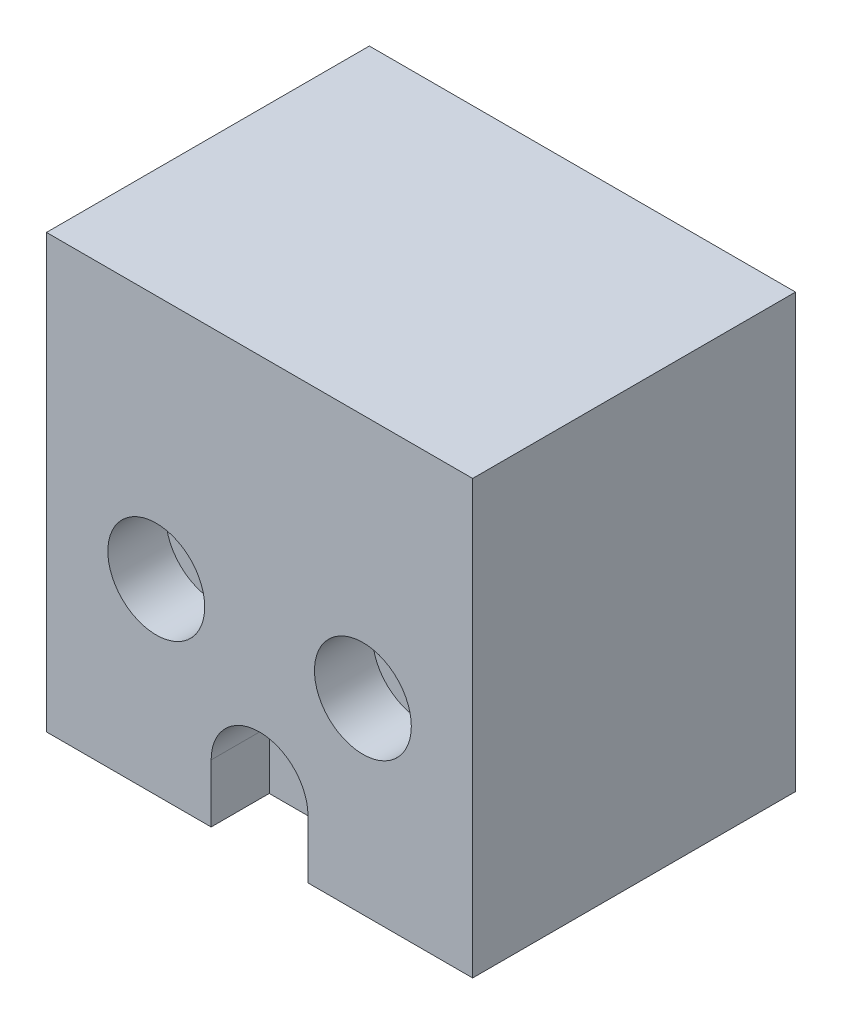
ISO-10303-21;
HEADER;
FILE_DESCRIPTION(('STEP AP214'),'2;1');
FILE_NAME('part.step','',(''),(''),'','','');
FILE_SCHEMA(('AUTOMOTIVE_DESIGN { 1 0 10303 214 1 1 1 1 }'));
ENDSEC;
DATA;
#1=APPLICATION_CONTEXT('core data for automotive mechanical design processes');
#2=APPLICATION_PROTOCOL_DEFINITION('international standard','automotive_design',2000,#1);
#3=PRODUCT_CONTEXT('',#1,'mechanical');
#4=PRODUCT('Part','Part','',(#3));
#5=PRODUCT_RELATED_PRODUCT_CATEGORY('part','',(#4));
#6=PRODUCT_DEFINITION_FORMATION('','',#4);
#7=PRODUCT_DEFINITION_CONTEXT('part definition',#1,'design');
#8=PRODUCT_DEFINITION('design','',#6,#7);
#9=PRODUCT_DEFINITION_SHAPE('','',#8);
#10=(LENGTH_UNIT() NAMED_UNIT(*) SI_UNIT(.MILLI.,.METRE.));
#11=(NAMED_UNIT(*) PLANE_ANGLE_UNIT() SI_UNIT($,.RADIAN.));
#12=(NAMED_UNIT(*) SI_UNIT($,.STERADIAN.) SOLID_ANGLE_UNIT());
#13=UNCERTAINTY_MEASURE_WITH_UNIT(LENGTH_MEASURE(1.E-05),#10,'distance_accuracy_value','');
#14=(GEOMETRIC_REPRESENTATION_CONTEXT(3) GLOBAL_UNCERTAINTY_ASSIGNED_CONTEXT((#13)) GLOBAL_UNIT_ASSIGNED_CONTEXT((#10,
#11,#12)) REPRESENTATION_CONTEXT('',''));
#15=CARTESIAN_POINT('',(0.,0.,0.));
#16=DIRECTION('',(0.,0.,1.));
#17=DIRECTION('',(1.,0.,0.));
#18=AXIS2_PLACEMENT_3D('',#15,#16,#17);
#19=CARTESIAN_POINT('',(0.,4.5,-25.));
#20=DIRECTION('',(0.,0.,1.));
#21=DIRECTION('',(1.,0.,0.));
#22=AXIS2_PLACEMENT_3D('',#19,#20,#21);
#23=CYLINDRICAL_SURFACE('',#22,2.25);
#24=CARTESIAN_POINT('',(0.,4.5,-25.));
#25=DIRECTION('',(0.,0.,1.));
#26=DIRECTION('',(1.,0.,0.));
#27=AXIS2_PLACEMENT_3D('',#24,#25,#26);
#28=CIRCLE('',#27,2.25);
#29=CARTESIAN_POINT('',(2.25,4.5,-25.));
#30=VERTEX_POINT('',#29);
#31=EDGE_CURVE('E156',#30,#30,#28,.T.);
#32=ORIENTED_EDGE('',*,*,#31,.F.);
#33=EDGE_LOOP('',(#32));
#34=FACE_BOUND('',#33,.T.);
#35=CARTESIAN_POINT('',(0.,4.5,-4.5));
#36=DIRECTION('',(0.,0.,1.));
#37=DIRECTION('',(1.,0.,0.));
#38=AXIS2_PLACEMENT_3D('',#35,#36,#37);
#39=CIRCLE('',#38,2.25);
#40=CARTESIAN_POINT('',(2.25,4.5,-4.5));
#41=VERTEX_POINT('',#40);
#42=EDGE_CURVE('E11',#41,#41,#39,.F.);
#43=ORIENTED_EDGE('',*,*,#42,.F.);
#44=EDGE_LOOP('',(#43));
#45=FACE_BOUND('',#44,.T.);
#46=ADVANCED_FACE('F34',(#34,#45),#23,.F.);
#47=CARTESIAN_POINT('',(8.,14.5,-25.));
#48=DIRECTION('',(0.,0.,1.));
#49=DIRECTION('',(1.,0.,0.));
#50=AXIS2_PLACEMENT_3D('',#47,#48,#49);
#51=CYLINDRICAL_SURFACE('',#50,2.25);
#52=CARTESIAN_POINT('',(8.,14.5,-25.));
#53=DIRECTION('',(0.,0.,1.));
#54=DIRECTION('',(1.,0.,0.));
#55=AXIS2_PLACEMENT_3D('',#52,#53,#54);
#56=CIRCLE('',#55,2.25);
#57=CARTESIAN_POINT('',(10.25,14.5,-25.));
#58=VERTEX_POINT('',#57);
#59=EDGE_CURVE('E152',#58,#58,#56,.T.);
#60=ORIENTED_EDGE('',*,*,#59,.F.);
#61=EDGE_LOOP('',(#60));
#62=FACE_BOUND('',#61,.T.);
#63=CARTESIAN_POINT('',(8.,14.5,-4.5));
#64=DIRECTION('',(0.,0.,1.));
#65=DIRECTION('',(1.,0.,0.));
#66=AXIS2_PLACEMENT_3D('',#63,#64,#65);
#67=CIRCLE('',#66,2.25);
#68=CARTESIAN_POINT('',(10.25,14.5,-4.5));
#69=VERTEX_POINT('',#68);
#70=EDGE_CURVE('E38',#69,#69,#67,.F.);
#71=ORIENTED_EDGE('',*,*,#70,.F.);
#72=EDGE_LOOP('',(#71));
#73=FACE_BOUND('',#72,.T.);
#74=ADVANCED_FACE('F231',(#62,#73),#51,.F.);
#75=CARTESIAN_POINT('',(-8.,14.5,-25.));
#76=DIRECTION('',(0.,0.,1.));
#77=DIRECTION('',(1.,0.,0.));
#78=AXIS2_PLACEMENT_3D('',#75,#76,#77);
#79=CYLINDRICAL_SURFACE('',#78,2.25);
#80=CARTESIAN_POINT('',(-8.,14.5,-25.));
#81=DIRECTION('',(0.,0.,1.));
#82=DIRECTION('',(1.,0.,0.));
#83=AXIS2_PLACEMENT_3D('',#80,#81,#82);
#84=CIRCLE('',#83,2.25);
#85=CARTESIAN_POINT('',(-5.75,14.5,-25.));
#86=VERTEX_POINT('',#85);
#87=EDGE_CURVE('E153',#86,#86,#84,.T.);
#88=ORIENTED_EDGE('',*,*,#87,.F.);
#89=EDGE_LOOP('',(#88));
#90=FACE_BOUND('',#89,.T.);
#91=CARTESIAN_POINT('',(-8.,14.5,-4.5));
#92=DIRECTION('',(0.,0.,1.));
#93=DIRECTION('',(1.,0.,0.));
#94=AXIS2_PLACEMENT_3D('',#91,#92,#93);
#95=CIRCLE('',#94,2.25);
#96=CARTESIAN_POINT('',(-5.75,14.5,-4.5));
#97=VERTEX_POINT('',#96);
#98=EDGE_CURVE('E146',#97,#97,#95,.F.);
#99=ORIENTED_EDGE('',*,*,#98,.F.);
#100=EDGE_LOOP('',(#99));
#101=FACE_BOUND('',#100,.T.);
#102=ADVANCED_FACE('F225',(#90,#101),#79,.F.);
#103=CARTESIAN_POINT('',(-16.5,33.5,-25.));
#104=DIRECTION('',(-1.,0.,0.));
#105=DIRECTION('',(0.,-1.,0.));
#106=AXIS2_PLACEMENT_3D('',#103,#104,#105);
#107=PLANE('',#106);
#108=DIRECTION('',(0.,-1.,0.));
#109=VECTOR('',#108,1.);
#110=CARTESIAN_POINT('',(-16.5,33.5,0.));
#111=LINE('',#110,#109);
#112=CARTESIAN_POINT('',(-16.5,33.5,0.));
#113=VERTEX_POINT('',#112);
#114=CARTESIAN_POINT('',(-16.5,0.,0.));
#115=VERTEX_POINT('',#114);
#116=EDGE_CURVE('E161',#113,#115,#111,.T.);
#117=ORIENTED_EDGE('',*,*,#116,.F.);
#118=DIRECTION('',(0.,0.,1.));
#119=VECTOR('',#118,1.);
#120=CARTESIAN_POINT('',(-16.5,33.5,-25.));
#121=LINE('',#120,#119);
#122=CARTESIAN_POINT('',(-16.5,33.5,-25.));
#123=VERTEX_POINT('',#122);
#124=EDGE_CURVE('E44',#123,#113,#121,.T.);
#125=ORIENTED_EDGE('',*,*,#124,.F.);
#126=DIRECTION('',(0.,-1.,0.));
#127=VECTOR('',#126,1.);
#128=CARTESIAN_POINT('',(-16.5,33.5,-25.));
#129=LINE('',#128,#127);
#130=CARTESIAN_POINT('',(-16.5,0.,-25.));
#131=VERTEX_POINT('',#130);
#132=EDGE_CURVE('E162',#123,#131,#129,.T.);
#133=ORIENTED_EDGE('',*,*,#132,.T.);
#134=DIRECTION('',(0.,0.,1.));
#135=VECTOR('',#134,1.);
#136=CARTESIAN_POINT('',(-16.5,0.,-25.));
#137=LINE('',#136,#135);
#138=EDGE_CURVE('E81',#131,#115,#137,.T.);
#139=ORIENTED_EDGE('',*,*,#138,.T.);
#140=EDGE_LOOP('',(#117,#125,#133,#139));
#141=FACE_BOUND('',#140,.T.);
#142=ADVANCED_FACE('F36',(#141),#107,.T.);
#143=CARTESIAN_POINT('',(-16.5,33.5,-25.));
#144=DIRECTION('',(0.,1.,0.));
#145=DIRECTION('',(0.,0.,1.));
#146=AXIS2_PLACEMENT_3D('',#143,#144,#145);
#147=PLANE('',#146);
#148=DIRECTION('',(-1.,0.,0.));
#149=VECTOR('',#148,1.);
#150=CARTESIAN_POINT('',(-16.5,33.5,0.));
#151=LINE('',#150,#149);
#152=CARTESIAN_POINT('',(16.5,33.5,0.));
#153=VERTEX_POINT('',#152);
#154=EDGE_CURVE('E165',#153,#113,#151,.T.);
#155=ORIENTED_EDGE('',*,*,#154,.F.);
#156=DIRECTION('',(0.,0.,1.));
#157=VECTOR('',#156,1.);
#158=CARTESIAN_POINT('',(16.5,33.5,-25.));
#159=LINE('',#158,#157);
#160=CARTESIAN_POINT('',(16.5,33.5,-25.));
#161=VERTEX_POINT('',#160);
#162=EDGE_CURVE('E70',#161,#153,#159,.T.);
#163=ORIENTED_EDGE('',*,*,#162,.F.);
#164=DIRECTION('',(-1.,0.,0.));
#165=VECTOR('',#164,1.);
#166=CARTESIAN_POINT('',(-16.5,33.5,-25.));
#167=LINE('',#166,#165);
#168=EDGE_CURVE('E169',#161,#123,#167,.T.);
#169=ORIENTED_EDGE('',*,*,#168,.T.);
#170=ORIENTED_EDGE('',*,*,#124,.T.);
#171=EDGE_LOOP('',(#155,#163,#169,#170));
#172=FACE_BOUND('',#171,.T.);
#173=ADVANCED_FACE('F219',(#172),#147,.T.);
#174=CARTESIAN_POINT('',(16.5,33.5,-25.));
#175=DIRECTION('',(1.,0.,0.));
#176=DIRECTION('',(0.,1.,0.));
#177=AXIS2_PLACEMENT_3D('',#174,#175,#176);
#178=PLANE('',#177);
#179=DIRECTION('',(0.,1.,0.));
#180=VECTOR('',#179,1.);
#181=CARTESIAN_POINT('',(16.5,33.5,0.));
#182=LINE('',#181,#180);
#183=CARTESIAN_POINT('',(16.5,0.,0.));
#184=VERTEX_POINT('',#183);
#185=EDGE_CURVE('E177',#184,#153,#182,.T.);
#186=ORIENTED_EDGE('',*,*,#185,.F.);
#187=DIRECTION('',(0.,0.,1.));
#188=VECTOR('',#187,1.);
#189=CARTESIAN_POINT('',(16.5,0.,-25.));
#190=LINE('',#189,#188);
#191=CARTESIAN_POINT('',(16.5,0.,-25.));
#192=VERTEX_POINT('',#191);
#193=EDGE_CURVE('E183',#192,#184,#190,.T.);
#194=ORIENTED_EDGE('',*,*,#193,.F.);
#195=DIRECTION('',(0.,1.,0.));
#196=VECTOR('',#195,1.);
#197=CARTESIAN_POINT('',(16.5,33.5,-25.));
#198=LINE('',#197,#196);
#199=EDGE_CURVE('E167',#192,#161,#198,.T.);
#200=ORIENTED_EDGE('',*,*,#199,.T.);
#201=ORIENTED_EDGE('',*,*,#162,.T.);
#202=EDGE_LOOP('',(#186,#194,#200,#201));
#203=FACE_BOUND('',#202,.T.);
#204=ADVANCED_FACE('F222',(#203),#178,.T.);
#205=CARTESIAN_POINT('',(-16.5,0.,-25.));
#206=DIRECTION('',(0.,-1.,0.));
#207=DIRECTION('',(0.,0.,-1.));
#208=AXIS2_PLACEMENT_3D('',#205,#206,#207);
#209=PLANE('',#208);
#210=DIRECTION('',(0.,0.,1.));
#211=VECTOR('',#210,1.);
#212=CARTESIAN_POINT('',(-3.75,0.,-13.246427842268));
#213=LINE('',#212,#211);
#214=CARTESIAN_POINT('',(-3.75,0.,-4.5));
#215=VERTEX_POINT('',#214);
#216=CARTESIAN_POINT('',(-3.75,0.,0.));
#217=VERTEX_POINT('',#216);
#218=EDGE_CURVE('E119',#215,#217,#213,.T.);
#219=ORIENTED_EDGE('',*,*,#218,.T.);
#220=DIRECTION('',(1.,0.,0.));
#221=VECTOR('',#220,1.);
#222=CARTESIAN_POINT('',(-16.5,0.,0.));
#223=LINE('',#222,#221);
#224=EDGE_CURVE('E174',#115,#217,#223,.T.);
#225=ORIENTED_EDGE('',*,*,#224,.F.);
#226=ORIENTED_EDGE('',*,*,#138,.F.);
#227=DIRECTION('',(1.,0.,0.));
#228=VECTOR('',#227,1.);
#229=CARTESIAN_POINT('',(-16.5,0.,-25.));
#230=LINE('',#229,#228);
#231=EDGE_CURVE('E164',#131,#192,#230,.T.);
#232=ORIENTED_EDGE('',*,*,#231,.T.);
#233=ORIENTED_EDGE('',*,*,#193,.T.);
#234=CARTESIAN_POINT('',(3.75,0.,0.));
#235=VERTEX_POINT('',#234);
#236=EDGE_CURVE('E173',#235,#184,#223,.T.);
#237=ORIENTED_EDGE('',*,*,#236,.F.);
#238=DIRECTION('',(0.,0.,1.));
#239=VECTOR('',#238,1.);
#240=CARTESIAN_POINT('',(3.75,0.,-13.246427842268));
#241=LINE('',#240,#239);
#242=CARTESIAN_POINT('',(3.75,0.,-4.5));
#243=VERTEX_POINT('',#242);
#244=EDGE_CURVE('E147',#243,#235,#241,.T.);
#245=ORIENTED_EDGE('',*,*,#244,.F.);
#246=DIRECTION('',(-1.,0.,0.));
#247=VECTOR('',#246,1.);
#248=CARTESIAN_POINT('',(3.75,0.,-4.5));
#249=LINE('',#248,#247);
#250=EDGE_CURVE('E134',#243,#215,#249,.T.);
#251=ORIENTED_EDGE('',*,*,#250,.T.);
#252=EDGE_LOOP('',(#219,#225,#226,#232,#233,#237,#245,#251));
#253=FACE_BOUND('',#252,.T.);
#254=ADVANCED_FACE('F218',(#253),#209,.T.);
#255=CARTESIAN_POINT('',(-16.5,0.,-25.));
#256=DIRECTION('',(0.,0.,1.));
#257=DIRECTION('',(1.,0.,0.));
#258=AXIS2_PLACEMENT_3D('',#255,#256,#257);
#259=PLANE('',#258);
#260=ORIENTED_EDGE('',*,*,#87,.T.);
#261=EDGE_LOOP('',(#260));
#262=FACE_BOUND('',#261,.T.);
#263=ORIENTED_EDGE('',*,*,#59,.T.);
#264=EDGE_LOOP('',(#263));
#265=FACE_BOUND('',#264,.T.);
#266=ORIENTED_EDGE('',*,*,#31,.T.);
#267=EDGE_LOOP('',(#266));
#268=FACE_BOUND('',#267,.T.);
#269=ORIENTED_EDGE('',*,*,#132,.F.);
#270=ORIENTED_EDGE('',*,*,#168,.F.);
#271=ORIENTED_EDGE('',*,*,#199,.F.);
#272=ORIENTED_EDGE('',*,*,#231,.F.);
#273=EDGE_LOOP('',(#269,#270,#271,#272));
#274=FACE_BOUND('',#273,.T.);
#275=ADVANCED_FACE('F210',(#262,#265,#268,#274),#259,.F.);
#276=CARTESIAN_POINT('',(-16.5,0.,0.));
#277=DIRECTION('',(0.,0.,1.));
#278=DIRECTION('',(1.,0.,0.));
#279=AXIS2_PLACEMENT_3D('',#276,#277,#278);
#280=PLANE('',#279);
#281=CARTESIAN_POINT('',(8.,14.5,0.));
#282=DIRECTION('',(0.,0.,1.));
#283=DIRECTION('',(1.,0.,0.));
#284=AXIS2_PLACEMENT_3D('',#281,#282,#283);
#285=CIRCLE('',#284,3.75);
#286=CARTESIAN_POINT('',(11.75,14.5,0.));
#287=VERTEX_POINT('',#286);
#288=EDGE_CURVE('E129',#287,#287,#285,.T.);
#289=ORIENTED_EDGE('',*,*,#288,.F.);
#290=EDGE_LOOP('',(#289));
#291=FACE_BOUND('',#290,.T.);
#292=CARTESIAN_POINT('',(0.,4.5,0.));
#293=DIRECTION('',(0.,0.,1.));
#294=DIRECTION('',(1.,0.,0.));
#295=AXIS2_PLACEMENT_3D('',#292,#293,#294);
#296=CIRCLE('',#295,3.75);
#297=CARTESIAN_POINT('',(3.75,4.5,0.));
#298=VERTEX_POINT('',#297);
#299=CARTESIAN_POINT('',(-3.75,4.5,0.));
#300=VERTEX_POINT('',#299);
#301=EDGE_CURVE('E115',#298,#300,#296,.T.);
#302=ORIENTED_EDGE('',*,*,#301,.F.);
#303=DIRECTION('',(0.,1.,0.));
#304=VECTOR('',#303,1.);
#305=CARTESIAN_POINT('',(3.75,4.5,0.));
#306=LINE('',#305,#304);
#307=EDGE_CURVE('E142',#235,#298,#306,.T.);
#308=ORIENTED_EDGE('',*,*,#307,.F.);
#309=ORIENTED_EDGE('',*,*,#236,.T.);
#310=ORIENTED_EDGE('',*,*,#185,.T.);
#311=ORIENTED_EDGE('',*,*,#154,.T.);
#312=ORIENTED_EDGE('',*,*,#116,.T.);
#313=ORIENTED_EDGE('',*,*,#224,.T.);
#314=DIRECTION('',(0.,-1.,0.));
#315=VECTOR('',#314,1.);
#316=CARTESIAN_POINT('',(-3.75,0.,0.));
#317=LINE('',#316,#315);
#318=EDGE_CURVE('E145',#300,#217,#317,.T.);
#319=ORIENTED_EDGE('',*,*,#318,.F.);
#320=EDGE_LOOP('',(#302,#308,#309,#310,#311,#312,#313,#319));
#321=FACE_BOUND('',#320,.T.);
#322=CARTESIAN_POINT('',(-8.,14.5,0.));
#323=DIRECTION('',(0.,0.,1.));
#324=DIRECTION('',(1.,0.,0.));
#325=AXIS2_PLACEMENT_3D('',#322,#323,#324);
#326=CIRCLE('',#325,3.75);
#327=CARTESIAN_POINT('',(-4.25,14.5,0.));
#328=VERTEX_POINT('',#327);
#329=EDGE_CURVE('E190',#328,#328,#326,.T.);
#330=ORIENTED_EDGE('',*,*,#329,.F.);
#331=EDGE_LOOP('',(#330));
#332=FACE_BOUND('',#331,.T.);
#333=ADVANCED_FACE('F207',(#291,#321,#332),#280,.T.);
#334=CARTESIAN_POINT('',(0.,0.,-4.5));
#335=DIRECTION('',(0.,0.,1.));
#336=DIRECTION('',(1.,0.,0.));
#337=AXIS2_PLACEMENT_3D('',#334,#335,#336);
#338=PLANE('',#337);
#339=ORIENTED_EDGE('',*,*,#42,.T.);
#340=EDGE_LOOP('',(#339));
#341=FACE_BOUND('',#340,.T.);
#342=DIRECTION('',(0.,-1.,0.));
#343=VECTOR('',#342,1.);
#344=CARTESIAN_POINT('',(3.75,4.5,-4.5));
#345=LINE('',#344,#343);
#346=CARTESIAN_POINT('',(3.75,4.5,-4.5));
#347=VERTEX_POINT('',#346);
#348=EDGE_CURVE('E128',#347,#243,#345,.T.);
#349=ORIENTED_EDGE('',*,*,#348,.F.);
#350=CARTESIAN_POINT('',(0.,4.5,-4.5));
#351=DIRECTION('',(0.,0.,1.));
#352=DIRECTION('',(1.,0.,0.));
#353=AXIS2_PLACEMENT_3D('',#350,#351,#352);
#354=CIRCLE('',#353,3.75);
#355=CARTESIAN_POINT('',(-3.75,4.5,-4.5));
#356=VERTEX_POINT('',#355);
#357=EDGE_CURVE('E112',#356,#347,#354,.F.);
#358=ORIENTED_EDGE('',*,*,#357,.F.);
#359=DIRECTION('',(0.,1.,0.));
#360=VECTOR('',#359,1.);
#361=CARTESIAN_POINT('',(-3.75,0.,-4.5));
#362=LINE('',#361,#360);
#363=EDGE_CURVE('E126',#215,#356,#362,.T.);
#364=ORIENTED_EDGE('',*,*,#363,.F.);
#365=ORIENTED_EDGE('',*,*,#250,.F.);
#366=EDGE_LOOP('',(#349,#358,#364,#365));
#367=FACE_BOUND('',#366,.T.);
#368=ADVANCED_FACE('F124',(#341,#367),#338,.T.);
#369=CARTESIAN_POINT('',(-3.75,0.,-13.246427842268));
#370=DIRECTION('',(-1.,0.,0.));
#371=DIRECTION('',(0.,0.,1.));
#372=AXIS2_PLACEMENT_3D('',#369,#370,#371);
#373=PLANE('',#372);
#374=ORIENTED_EDGE('',*,*,#363,.T.);
#375=DIRECTION('',(0.,0.,1.));
#376=VECTOR('',#375,1.);
#377=CARTESIAN_POINT('',(-3.75,4.5,-13.246427842268));
#378=LINE('',#377,#376);
#379=EDGE_CURVE('E109',#356,#300,#378,.T.);
#380=ORIENTED_EDGE('',*,*,#379,.T.);
#381=ORIENTED_EDGE('',*,*,#318,.T.);
#382=ORIENTED_EDGE('',*,*,#218,.F.);
#383=EDGE_LOOP('',(#374,#380,#381,#382));
#384=FACE_BOUND('',#383,.T.);
#385=ADVANCED_FACE('F131',(#384),#373,.F.);
#386=CARTESIAN_POINT('',(3.75,4.5,-13.246427842268));
#387=DIRECTION('',(1.,0.,0.));
#388=DIRECTION('',(0.,0.,-1.));
#389=AXIS2_PLACEMENT_3D('',#386,#387,#388);
#390=PLANE('',#389);
#391=ORIENTED_EDGE('',*,*,#348,.T.);
#392=ORIENTED_EDGE('',*,*,#244,.T.);
#393=ORIENTED_EDGE('',*,*,#307,.T.);
#394=DIRECTION('',(0.,0.,1.));
#395=VECTOR('',#394,1.);
#396=CARTESIAN_POINT('',(3.75,4.5,-13.246427842268));
#397=LINE('',#396,#395);
#398=EDGE_CURVE('E120',#347,#298,#397,.T.);
#399=ORIENTED_EDGE('',*,*,#398,.F.);
#400=EDGE_LOOP('',(#391,#392,#393,#399));
#401=FACE_BOUND('',#400,.T.);
#402=ADVANCED_FACE('F216',(#401),#390,.F.);
#403=CARTESIAN_POINT('',(0.,0.,-4.5));
#404=DIRECTION('',(0.,0.,1.));
#405=DIRECTION('',(1.,0.,0.));
#406=AXIS2_PLACEMENT_3D('',#403,#404,#405);
#407=PLANE('',#406);
#408=CARTESIAN_POINT('',(-8.,14.5,-4.5));
#409=DIRECTION('',(0.,0.,1.));
#410=DIRECTION('',(1.,0.,0.));
#411=AXIS2_PLACEMENT_3D('',#408,#409,#410);
#412=CIRCLE('',#411,3.75);
#413=CARTESIAN_POINT('',(-4.25,14.5,-4.5));
#414=VERTEX_POINT('',#413);
#415=EDGE_CURVE('E139',#414,#414,#412,.F.);
#416=ORIENTED_EDGE('',*,*,#415,.F.);
#417=EDGE_LOOP('',(#416));
#418=FACE_BOUND('',#417,.T.);
#419=ORIENTED_EDGE('',*,*,#98,.T.);
#420=EDGE_LOOP('',(#419));
#421=FACE_BOUND('',#420,.T.);
#422=ADVANCED_FACE('F282',(#418,#421),#407,.T.);
#423=CARTESIAN_POINT('',(-8.,14.5,-15.1066017177982));
#424=DIRECTION('',(0.,0.,1.));
#425=DIRECTION('',(1.,0.,0.));
#426=AXIS2_PLACEMENT_3D('',#423,#424,#425);
#427=CYLINDRICAL_SURFACE('',#426,3.75);
#428=ORIENTED_EDGE('',*,*,#415,.T.);
#429=EDGE_LOOP('',(#428));
#430=FACE_BOUND('',#429,.T.);
#431=ORIENTED_EDGE('',*,*,#329,.T.);
#432=EDGE_LOOP('',(#431));
#433=FACE_BOUND('',#432,.T.);
#434=ADVANCED_FACE('F289',(#430,#433),#427,.F.);
#435=CARTESIAN_POINT('',(0.,4.5,-15.1066017177982));
#436=DIRECTION('',(0.,0.,1.));
#437=DIRECTION('',(1.,0.,0.));
#438=AXIS2_PLACEMENT_3D('',#435,#436,#437);
#439=CYLINDRICAL_SURFACE('',#438,3.75);
#440=ORIENTED_EDGE('',*,*,#357,.T.);
#441=ORIENTED_EDGE('',*,*,#398,.T.);
#442=ORIENTED_EDGE('',*,*,#301,.T.);
#443=ORIENTED_EDGE('',*,*,#379,.F.);
#444=EDGE_LOOP('',(#440,#441,#442,#443));
#445=FACE_BOUND('',#444,.T.);
#446=ADVANCED_FACE('F111',(#445),#439,.F.);
#447=CARTESIAN_POINT('',(0.,0.,-4.5));
#448=DIRECTION('',(0.,0.,1.));
#449=DIRECTION('',(1.,0.,0.));
#450=AXIS2_PLACEMENT_3D('',#447,#448,#449);
#451=PLANE('',#450);
#452=CARTESIAN_POINT('',(8.,14.5,-4.5));
#453=DIRECTION('',(0.,0.,1.));
#454=DIRECTION('',(1.,0.,0.));
#455=AXIS2_PLACEMENT_3D('',#452,#453,#454);
#456=CIRCLE('',#455,3.75);
#457=CARTESIAN_POINT('',(11.75,14.5,-4.5));
#458=VERTEX_POINT('',#457);
#459=EDGE_CURVE('E197',#458,#458,#456,.F.);
#460=ORIENTED_EDGE('',*,*,#459,.F.);
#461=EDGE_LOOP('',(#460));
#462=FACE_BOUND('',#461,.T.);
#463=ORIENTED_EDGE('',*,*,#70,.T.);
#464=EDGE_LOOP('',(#463));
#465=FACE_BOUND('',#464,.T.);
#466=ADVANCED_FACE('F303',(#462,#465),#451,.T.);
#467=CARTESIAN_POINT('',(8.,14.5,-15.1066017177982));
#468=DIRECTION('',(0.,0.,1.));
#469=DIRECTION('',(1.,0.,0.));
#470=AXIS2_PLACEMENT_3D('',#467,#468,#469);
#471=CYLINDRICAL_SURFACE('',#470,3.75);
#472=ORIENTED_EDGE('',*,*,#459,.T.);
#473=EDGE_LOOP('',(#472));
#474=FACE_BOUND('',#473,.T.);
#475=ORIENTED_EDGE('',*,*,#288,.T.);
#476=EDGE_LOOP('',(#475));
#477=FACE_BOUND('',#476,.T.);
#478=ADVANCED_FACE('F205',(#474,#477),#471,.F.);
#479=CLOSED_SHELL('',(#46,#74,#102,#142,#173,#204,#254,#275,#333,#368,#385,#402,#422,#434,#446,
#466,#478));
#480=MANIFOLD_SOLID_BREP('B2',#479);
#481=ADVANCED_BREP_SHAPE_REPRESENTATION('',(#18,#480),#14);
#482=SHAPE_DEFINITION_REPRESENTATION(#9,#481);
ENDSEC;
END-ISO-10303-21;
